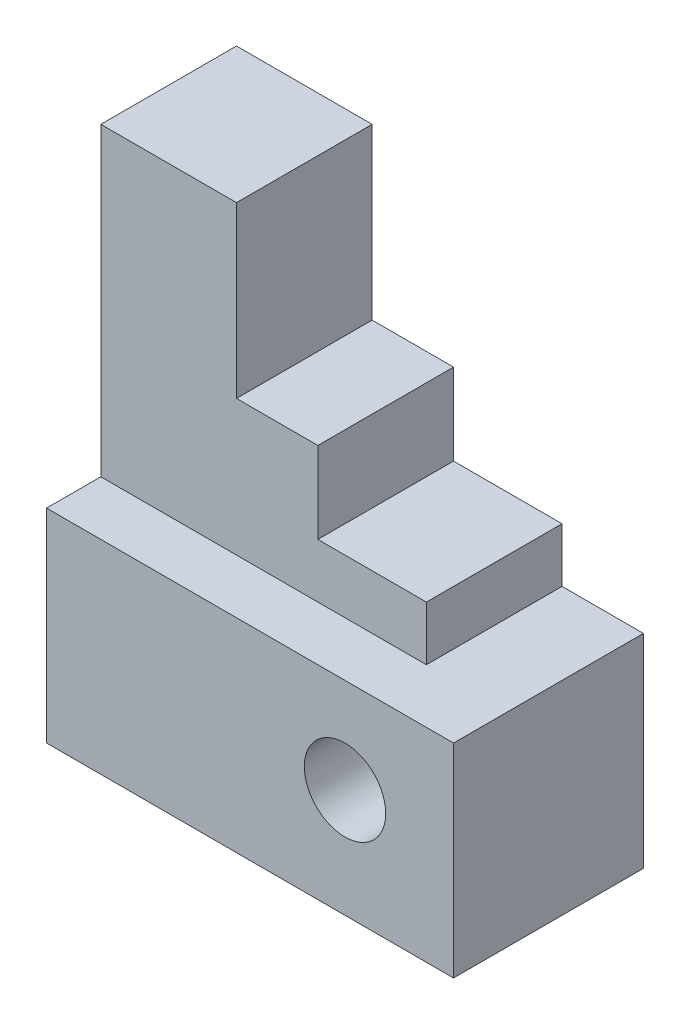
ISO-10303-21;
HEADER;
FILE_DESCRIPTION(('STEP AP214'),'2;1');
FILE_NAME('part.step','',(''),(''),'','','');
FILE_SCHEMA(('AUTOMOTIVE_DESIGN { 1 0 10303 214 1 1 1 1 }'));
ENDSEC;
DATA;
#1=APPLICATION_CONTEXT('core data for automotive mechanical design processes');
#2=APPLICATION_PROTOCOL_DEFINITION('international standard','automotive_design',2000,#1);
#3=PRODUCT_CONTEXT('',#1,'mechanical');
#4=PRODUCT('Part','Part','',(#3));
#5=PRODUCT_RELATED_PRODUCT_CATEGORY('part','',(#4));
#6=PRODUCT_DEFINITION_FORMATION('','',#4);
#7=PRODUCT_DEFINITION_CONTEXT('part definition',#1,'design');
#8=PRODUCT_DEFINITION('design','',#6,#7);
#9=PRODUCT_DEFINITION_SHAPE('','',#8);
#10=(LENGTH_UNIT() NAMED_UNIT(*) SI_UNIT(.MILLI.,.METRE.));
#11=(NAMED_UNIT(*) PLANE_ANGLE_UNIT() SI_UNIT($,.RADIAN.));
#12=(NAMED_UNIT(*) SI_UNIT($,.STERADIAN.) SOLID_ANGLE_UNIT());
#13=UNCERTAINTY_MEASURE_WITH_UNIT(LENGTH_MEASURE(1.E-05),#10,'distance_accuracy_value','');
#14=(GEOMETRIC_REPRESENTATION_CONTEXT(3) GLOBAL_UNCERTAINTY_ASSIGNED_CONTEXT((#13)) GLOBAL_UNIT_ASSIGNED_CONTEXT((#10,
#11,#12)) REPRESENTATION_CONTEXT('',''));
#15=CARTESIAN_POINT('',(0.,0.,0.));
#16=DIRECTION('',(0.,0.,1.));
#17=DIRECTION('',(1.,0.,0.));
#18=AXIS2_PLACEMENT_3D('',#15,#16,#17);
#19=CARTESIAN_POINT('',(0.,0.,28.));
#20=DIRECTION('',(0.,1.,0.));
#21=DIRECTION('',(0.,0.,1.));
#22=AXIS2_PLACEMENT_3D('',#19,#20,#21);
#23=PLANE('',#22);
#24=DIRECTION('',(1.,0.,0.));
#25=VECTOR('',#24,1.);
#26=CARTESIAN_POINT('',(0.,0.,0.));
#27=LINE('',#26,#25);
#28=CARTESIAN_POINT('',(0.,0.,0.));
#29=VERTEX_POINT('',#28);
#30=CARTESIAN_POINT('',(60.,0.,0.));
#31=VERTEX_POINT('',#30);
#32=EDGE_CURVE('E239',#29,#31,#27,.T.);
#33=ORIENTED_EDGE('',*,*,#32,.T.);
#34=DIRECTION('',(0.,0.,-1.));
#35=VECTOR('',#34,1.);
#36=CARTESIAN_POINT('',(60.,0.,28.));
#37=LINE('',#36,#35);
#38=CARTESIAN_POINT('',(60.,0.,28.));
#39=VERTEX_POINT('',#38);
#40=EDGE_CURVE('E11',#39,#31,#37,.T.);
#41=ORIENTED_EDGE('',*,*,#40,.F.);
#42=DIRECTION('',(1.,0.,0.));
#43=VECTOR('',#42,1.);
#44=CARTESIAN_POINT('',(0.,0.,28.));
#45=LINE('',#44,#43);
#46=CARTESIAN_POINT('',(0.,0.,28.));
#47=VERTEX_POINT('',#46);
#48=EDGE_CURVE('E219',#47,#39,#45,.T.);
#49=ORIENTED_EDGE('',*,*,#48,.F.);
#50=DIRECTION('',(0.,0.,-1.));
#51=VECTOR('',#50,1.);
#52=CARTESIAN_POINT('',(0.,0.,28.));
#53=LINE('',#52,#51);
#54=EDGE_CURVE('E235',#47,#29,#53,.T.);
#55=ORIENTED_EDGE('',*,*,#54,.T.);
#56=EDGE_LOOP('',(#33,#41,#49,#55));
#57=FACE_BOUND('',#56,.T.);
#58=ADVANCED_FACE('F45',(#57),#23,.F.);
#59=CARTESIAN_POINT('',(60.,0.,28.));
#60=DIRECTION('',(-1.,0.,0.));
#61=DIRECTION('',(0.,0.,1.));
#62=AXIS2_PLACEMENT_3D('',#59,#60,#61);
#63=PLANE('',#62);
#64=DIRECTION('',(0.,1.,0.));
#65=VECTOR('',#64,1.);
#66=CARTESIAN_POINT('',(60.,0.,0.));
#67=LINE('',#66,#65);
#68=CARTESIAN_POINT('',(60.,30.,0.));
#69=VERTEX_POINT('',#68);
#70=EDGE_CURVE('E243',#31,#69,#67,.T.);
#71=ORIENTED_EDGE('',*,*,#70,.T.);
#72=DIRECTION('',(0.,0.,-1.));
#73=VECTOR('',#72,1.);
#74=CARTESIAN_POINT('',(60.,30.,28.));
#75=LINE('',#74,#73);
#76=CARTESIAN_POINT('',(60.,30.,28.));
#77=VERTEX_POINT('',#76);
#78=EDGE_CURVE('E54',#77,#69,#75,.T.);
#79=ORIENTED_EDGE('',*,*,#78,.F.);
#80=DIRECTION('',(0.,1.,0.));
#81=VECTOR('',#80,1.);
#82=CARTESIAN_POINT('',(60.,0.,28.));
#83=LINE('',#82,#81);
#84=EDGE_CURVE('E224',#39,#77,#83,.T.);
#85=ORIENTED_EDGE('',*,*,#84,.F.);
#86=ORIENTED_EDGE('',*,*,#40,.T.);
#87=EDGE_LOOP('',(#71,#79,#85,#86));
#88=FACE_BOUND('',#87,.T.);
#89=ADVANCED_FACE('F260',(#88),#63,.F.);
#90=CARTESIAN_POINT('',(0.,30.,28.));
#91=DIRECTION('',(0.,1.,0.));
#92=DIRECTION('',(0.,0.,1.));
#93=AXIS2_PLACEMENT_3D('',#90,#91,#92);
#94=PLANE('',#93);
#95=DIRECTION('',(0.,0.,-1.));
#96=VECTOR('',#95,1.);
#97=CARTESIAN_POINT('',(48.,30.,20.));
#98=LINE('',#97,#96);
#99=CARTESIAN_POINT('',(48.,30.,20.));
#100=VERTEX_POINT('',#99);
#101=CARTESIAN_POINT('',(48.,30.,0.));
#102=VERTEX_POINT('',#101);
#103=EDGE_CURVE('E206',#100,#102,#98,.T.);
#104=ORIENTED_EDGE('',*,*,#103,.F.);
#105=DIRECTION('',(1.,0.,0.));
#106=VECTOR('',#105,1.);
#107=CARTESIAN_POINT('',(0.,30.,20.));
#108=LINE('',#107,#106);
#109=CARTESIAN_POINT('',(0.,30.,20.));
#110=VERTEX_POINT('',#109);
#111=EDGE_CURVE('E61',#110,#100,#108,.T.);
#112=ORIENTED_EDGE('',*,*,#111,.F.);
#113=DIRECTION('',(0.,0.,-1.));
#114=VECTOR('',#113,1.);
#115=CARTESIAN_POINT('',(0.,30.,28.));
#116=LINE('',#115,#114);
#117=CARTESIAN_POINT('',(0.,30.,28.));
#118=VERTEX_POINT('',#117);
#119=EDGE_CURVE('E253',#118,#110,#116,.T.);
#120=ORIENTED_EDGE('',*,*,#119,.F.);
#121=DIRECTION('',(1.,0.,0.));
#122=VECTOR('',#121,1.);
#123=CARTESIAN_POINT('',(0.,30.,28.));
#124=LINE('',#123,#122);
#125=EDGE_CURVE('E227',#118,#77,#124,.T.);
#126=ORIENTED_EDGE('',*,*,#125,.T.);
#127=ORIENTED_EDGE('',*,*,#78,.T.);
#128=DIRECTION('',(1.,0.,0.));
#129=VECTOR('',#128,1.);
#130=CARTESIAN_POINT('',(0.,30.,0.));
#131=LINE('',#130,#129);
#132=EDGE_CURVE('E67',#102,#69,#131,.T.);
#133=ORIENTED_EDGE('',*,*,#132,.F.);
#134=EDGE_LOOP('',(#104,#112,#120,#126,#127,#133));
#135=FACE_BOUND('',#134,.T.);
#136=ADVANCED_FACE('F257',(#135),#94,.T.);
#137=CARTESIAN_POINT('',(44.,16.,28.));
#138=DIRECTION('',(0.,0.,-1.));
#139=DIRECTION('',(-1.,0.,0.));
#140=AXIS2_PLACEMENT_3D('',#137,#138,#139);
#141=CYLINDRICAL_SURFACE('',#140,6.);
#142=CARTESIAN_POINT('',(44.,16.,28.));
#143=DIRECTION('',(0.,0.,1.));
#144=DIRECTION('',(1.,0.,0.));
#145=AXIS2_PLACEMENT_3D('',#142,#143,#144);
#146=CIRCLE('',#145,6.);
#147=CARTESIAN_POINT('',(50.,16.,28.));
#148=VERTEX_POINT('',#147);
#149=EDGE_CURVE('E215',#148,#148,#146,.T.);
#150=ORIENTED_EDGE('',*,*,#149,.T.);
#151=EDGE_LOOP('',(#150));
#152=FACE_BOUND('',#151,.T.);
#153=CARTESIAN_POINT('',(44.,16.,0.));
#154=DIRECTION('',(0.,0.,1.));
#155=DIRECTION('',(1.,0.,0.));
#156=AXIS2_PLACEMENT_3D('',#153,#154,#155);
#157=CIRCLE('',#156,6.);
#158=CARTESIAN_POINT('',(50.,16.,0.));
#159=VERTEX_POINT('',#158);
#160=EDGE_CURVE('E139',#159,#159,#157,.T.);
#161=ORIENTED_EDGE('',*,*,#160,.F.);
#162=EDGE_LOOP('',(#161));
#163=FACE_BOUND('',#162,.T.);
#164=ADVANCED_FACE('F47',(#152,#163),#141,.F.);
#165=CARTESIAN_POINT('',(0.,0.,28.));
#166=DIRECTION('',(-1.,0.,0.));
#167=DIRECTION('',(0.,0.,1.));
#168=AXIS2_PLACEMENT_3D('',#165,#166,#167);
#169=PLANE('',#168);
#170=DIRECTION('',(0.,1.,0.));
#171=VECTOR('',#170,1.);
#172=CARTESIAN_POINT('',(0.,0.,0.));
#173=LINE('',#172,#171);
#174=CARTESIAN_POINT('',(0.,75.,0.));
#175=VERTEX_POINT('',#174);
#176=EDGE_CURVE('E220',#29,#175,#173,.T.);
#177=ORIENTED_EDGE('',*,*,#176,.F.);
#178=ORIENTED_EDGE('',*,*,#54,.F.);
#179=DIRECTION('',(0.,1.,0.));
#180=VECTOR('',#179,1.);
#181=CARTESIAN_POINT('',(0.,0.,28.));
#182=LINE('',#181,#180);
#183=EDGE_CURVE('E231',#47,#118,#182,.T.);
#184=ORIENTED_EDGE('',*,*,#183,.T.);
#185=ORIENTED_EDGE('',*,*,#119,.T.);
#186=DIRECTION('',(0.,1.,0.));
#187=VECTOR('',#186,1.);
#188=CARTESIAN_POINT('',(0.,0.,20.));
#189=LINE('',#188,#187);
#190=CARTESIAN_POINT('',(0.,75.,20.));
#191=VERTEX_POINT('',#190);
#192=EDGE_CURVE('E166',#110,#191,#189,.T.);
#193=ORIENTED_EDGE('',*,*,#192,.T.);
#194=DIRECTION('',(0.,0.,-1.));
#195=VECTOR('',#194,1.);
#196=CARTESIAN_POINT('',(0.,75.,20.));
#197=LINE('',#196,#195);
#198=EDGE_CURVE('E209',#191,#175,#197,.T.);
#199=ORIENTED_EDGE('',*,*,#198,.T.);
#200=EDGE_LOOP('',(#177,#178,#184,#185,#193,#199));
#201=FACE_BOUND('',#200,.T.);
#202=ADVANCED_FACE('F275',(#201),#169,.T.);
#203=CARTESIAN_POINT('',(0.,0.,28.));
#204=DIRECTION('',(0.,0.,1.));
#205=DIRECTION('',(1.,0.,0.));
#206=AXIS2_PLACEMENT_3D('',#203,#204,#205);
#207=PLANE('',#206);
#208=ORIENTED_EDGE('',*,*,#149,.F.);
#209=EDGE_LOOP('',(#208));
#210=FACE_BOUND('',#209,.T.);
#211=ORIENTED_EDGE('',*,*,#48,.T.);
#212=ORIENTED_EDGE('',*,*,#84,.T.);
#213=ORIENTED_EDGE('',*,*,#125,.F.);
#214=ORIENTED_EDGE('',*,*,#183,.F.);
#215=EDGE_LOOP('',(#211,#212,#213,#214));
#216=FACE_BOUND('',#215,.T.);
#217=ADVANCED_FACE('F279',(#210,#216),#207,.T.);
#218=CARTESIAN_POINT('',(0.,0.,0.));
#219=DIRECTION('',(0.,0.,1.));
#220=DIRECTION('',(1.,0.,0.));
#221=AXIS2_PLACEMENT_3D('',#218,#219,#220);
#222=PLANE('',#221);
#223=ORIENTED_EDGE('',*,*,#160,.T.);
#224=EDGE_LOOP('',(#223));
#225=FACE_BOUND('',#224,.T.);
#226=ORIENTED_EDGE('',*,*,#32,.F.);
#227=ORIENTED_EDGE('',*,*,#176,.T.);
#228=DIRECTION('',(1.,0.,0.));
#229=VECTOR('',#228,1.);
#230=CARTESIAN_POINT('',(0.,75.,0.));
#231=LINE('',#230,#229);
#232=CARTESIAN_POINT('',(20.,75.,0.));
#233=VERTEX_POINT('',#232);
#234=EDGE_CURVE('E187',#175,#233,#231,.T.);
#235=ORIENTED_EDGE('',*,*,#234,.T.);
#236=DIRECTION('',(0.,1.,0.));
#237=VECTOR('',#236,1.);
#238=CARTESIAN_POINT('',(20.,0.,0.));
#239=LINE('',#238,#237);
#240=CARTESIAN_POINT('',(20.,50.,0.));
#241=VERTEX_POINT('',#240);
#242=EDGE_CURVE('E184',#241,#233,#239,.T.);
#243=ORIENTED_EDGE('',*,*,#242,.F.);
#244=DIRECTION('',(1.,0.,0.));
#245=VECTOR('',#244,1.);
#246=CARTESIAN_POINT('',(0.,50.,0.));
#247=LINE('',#246,#245);
#248=CARTESIAN_POINT('',(32.,50.,0.));
#249=VERTEX_POINT('',#248);
#250=EDGE_CURVE('E134',#241,#249,#247,.T.);
#251=ORIENTED_EDGE('',*,*,#250,.T.);
#252=DIRECTION('',(0.,1.,0.));
#253=VECTOR('',#252,1.);
#254=CARTESIAN_POINT('',(32.,0.,0.));
#255=LINE('',#254,#253);
#256=CARTESIAN_POINT('',(32.,38.,0.));
#257=VERTEX_POINT('',#256);
#258=EDGE_CURVE('E157',#257,#249,#255,.T.);
#259=ORIENTED_EDGE('',*,*,#258,.F.);
#260=DIRECTION('',(1.,0.,0.));
#261=VECTOR('',#260,1.);
#262=CARTESIAN_POINT('',(0.,38.,0.));
#263=LINE('',#262,#261);
#264=CARTESIAN_POINT('',(48.,38.,0.));
#265=VERTEX_POINT('',#264);
#266=EDGE_CURVE('E161',#257,#265,#263,.T.);
#267=ORIENTED_EDGE('',*,*,#266,.T.);
#268=DIRECTION('',(0.,1.,0.));
#269=VECTOR('',#268,1.);
#270=CARTESIAN_POINT('',(48.,0.,0.));
#271=LINE('',#270,#269);
#272=EDGE_CURVE('E191',#102,#265,#271,.T.);
#273=ORIENTED_EDGE('',*,*,#272,.F.);
#274=ORIENTED_EDGE('',*,*,#132,.T.);
#275=ORIENTED_EDGE('',*,*,#70,.F.);
#276=EDGE_LOOP('',(#226,#227,#235,#243,#251,#259,#267,#273,#274,#275));
#277=FACE_BOUND('',#276,.T.);
#278=ADVANCED_FACE('F264',(#225,#277),#222,.F.);
#279=CARTESIAN_POINT('',(0.,50.,20.));
#280=DIRECTION('',(0.,1.,0.));
#281=DIRECTION('',(0.,0.,1.));
#282=AXIS2_PLACEMENT_3D('',#279,#280,#281);
#283=PLANE('',#282);
#284=ORIENTED_EDGE('',*,*,#250,.F.);
#285=DIRECTION('',(0.,0.,-1.));
#286=VECTOR('',#285,1.);
#287=CARTESIAN_POINT('',(20.,50.,20.));
#288=LINE('',#287,#286);
#289=CARTESIAN_POINT('',(20.,50.,20.));
#290=VERTEX_POINT('',#289);
#291=EDGE_CURVE('E128',#290,#241,#288,.T.);
#292=ORIENTED_EDGE('',*,*,#291,.F.);
#293=DIRECTION('',(1.,0.,0.));
#294=VECTOR('',#293,1.);
#295=CARTESIAN_POINT('',(0.,50.,20.));
#296=LINE('',#295,#294);
#297=CARTESIAN_POINT('',(32.,50.,20.));
#298=VERTEX_POINT('',#297);
#299=EDGE_CURVE('E132',#290,#298,#296,.T.);
#300=ORIENTED_EDGE('',*,*,#299,.T.);
#301=DIRECTION('',(0.,0.,-1.));
#302=VECTOR('',#301,1.);
#303=CARTESIAN_POINT('',(32.,50.,20.));
#304=LINE('',#303,#302);
#305=EDGE_CURVE('E181',#298,#249,#304,.T.);
#306=ORIENTED_EDGE('',*,*,#305,.T.);
#307=EDGE_LOOP('',(#284,#292,#300,#306));
#308=FACE_BOUND('',#307,.T.);
#309=ADVANCED_FACE('F130',(#308),#283,.T.);
#310=CARTESIAN_POINT('',(20.,0.,20.));
#311=DIRECTION('',(-1.,0.,0.));
#312=DIRECTION('',(0.,0.,1.));
#313=AXIS2_PLACEMENT_3D('',#310,#311,#312);
#314=PLANE('',#313);
#315=ORIENTED_EDGE('',*,*,#242,.T.);
#316=DIRECTION('',(0.,0.,-1.));
#317=VECTOR('',#316,1.);
#318=CARTESIAN_POINT('',(20.,75.,20.));
#319=LINE('',#318,#317);
#320=CARTESIAN_POINT('',(20.,75.,20.));
#321=VERTEX_POINT('',#320);
#322=EDGE_CURVE('E140',#321,#233,#319,.T.);
#323=ORIENTED_EDGE('',*,*,#322,.F.);
#324=DIRECTION('',(0.,1.,0.));
#325=VECTOR('',#324,1.);
#326=CARTESIAN_POINT('',(20.,0.,20.));
#327=LINE('',#326,#325);
#328=EDGE_CURVE('E143',#290,#321,#327,.T.);
#329=ORIENTED_EDGE('',*,*,#328,.F.);
#330=ORIENTED_EDGE('',*,*,#291,.T.);
#331=EDGE_LOOP('',(#315,#323,#329,#330));
#332=FACE_BOUND('',#331,.T.);
#333=ADVANCED_FACE('F144',(#332),#314,.F.);
#334=CARTESIAN_POINT('',(0.,75.,20.));
#335=DIRECTION('',(0.,1.,0.));
#336=DIRECTION('',(0.,0.,1.));
#337=AXIS2_PLACEMENT_3D('',#334,#335,#336);
#338=PLANE('',#337);
#339=ORIENTED_EDGE('',*,*,#234,.F.);
#340=ORIENTED_EDGE('',*,*,#198,.F.);
#341=DIRECTION('',(1.,0.,0.));
#342=VECTOR('',#341,1.);
#343=CARTESIAN_POINT('',(0.,75.,20.));
#344=LINE('',#343,#342);
#345=EDGE_CURVE('E149',#191,#321,#344,.T.);
#346=ORIENTED_EDGE('',*,*,#345,.T.);
#347=ORIENTED_EDGE('',*,*,#322,.T.);
#348=EDGE_LOOP('',(#339,#340,#346,#347));
#349=FACE_BOUND('',#348,.T.);
#350=ADVANCED_FACE('F283',(#349),#338,.T.);
#351=CARTESIAN_POINT('',(48.,0.,20.));
#352=DIRECTION('',(-1.,0.,0.));
#353=DIRECTION('',(0.,0.,1.));
#354=AXIS2_PLACEMENT_3D('',#351,#352,#353);
#355=PLANE('',#354);
#356=ORIENTED_EDGE('',*,*,#272,.T.);
#357=DIRECTION('',(0.,0.,-1.));
#358=VECTOR('',#357,1.);
#359=CARTESIAN_POINT('',(48.,38.,20.));
#360=LINE('',#359,#358);
#361=CARTESIAN_POINT('',(48.,38.,20.));
#362=VERTEX_POINT('',#361);
#363=EDGE_CURVE('E203',#362,#265,#360,.T.);
#364=ORIENTED_EDGE('',*,*,#363,.F.);
#365=DIRECTION('',(0.,1.,0.));
#366=VECTOR('',#365,1.);
#367=CARTESIAN_POINT('',(48.,0.,20.));
#368=LINE('',#367,#366);
#369=EDGE_CURVE('E172',#100,#362,#368,.T.);
#370=ORIENTED_EDGE('',*,*,#369,.F.);
#371=ORIENTED_EDGE('',*,*,#103,.T.);
#372=EDGE_LOOP('',(#356,#364,#370,#371));
#373=FACE_BOUND('',#372,.T.);
#374=ADVANCED_FACE('F271',(#373),#355,.F.);
#375=CARTESIAN_POINT('',(0.,38.,20.));
#376=DIRECTION('',(0.,1.,0.));
#377=DIRECTION('',(0.,0.,1.));
#378=AXIS2_PLACEMENT_3D('',#375,#376,#377);
#379=PLANE('',#378);
#380=ORIENTED_EDGE('',*,*,#266,.F.);
#381=DIRECTION('',(0.,0.,-1.));
#382=VECTOR('',#381,1.);
#383=CARTESIAN_POINT('',(32.,38.,20.));
#384=LINE('',#383,#382);
#385=CARTESIAN_POINT('',(32.,38.,20.));
#386=VERTEX_POINT('',#385);
#387=EDGE_CURVE('E200',#386,#257,#384,.T.);
#388=ORIENTED_EDGE('',*,*,#387,.F.);
#389=DIRECTION('',(1.,0.,0.));
#390=VECTOR('',#389,1.);
#391=CARTESIAN_POINT('',(0.,38.,20.));
#392=LINE('',#391,#390);
#393=EDGE_CURVE('E175',#386,#362,#392,.T.);
#394=ORIENTED_EDGE('',*,*,#393,.T.);
#395=ORIENTED_EDGE('',*,*,#363,.T.);
#396=EDGE_LOOP('',(#380,#388,#394,#395));
#397=FACE_BOUND('',#396,.T.);
#398=ADVANCED_FACE('F290',(#397),#379,.T.);
#399=CARTESIAN_POINT('',(32.,0.,20.));
#400=DIRECTION('',(-1.,0.,0.));
#401=DIRECTION('',(0.,0.,1.));
#402=AXIS2_PLACEMENT_3D('',#399,#400,#401);
#403=PLANE('',#402);
#404=ORIENTED_EDGE('',*,*,#258,.T.);
#405=ORIENTED_EDGE('',*,*,#305,.F.);
#406=DIRECTION('',(0.,1.,0.));
#407=VECTOR('',#406,1.);
#408=CARTESIAN_POINT('',(32.,0.,20.));
#409=LINE('',#408,#407);
#410=EDGE_CURVE('E154',#386,#298,#409,.T.);
#411=ORIENTED_EDGE('',*,*,#410,.F.);
#412=ORIENTED_EDGE('',*,*,#387,.T.);
#413=EDGE_LOOP('',(#404,#405,#411,#412));
#414=FACE_BOUND('',#413,.T.);
#415=ADVANCED_FACE('F340',(#414),#403,.F.);
#416=CARTESIAN_POINT('',(0.,0.,20.));
#417=DIRECTION('',(0.,0.,1.));
#418=DIRECTION('',(1.,0.,0.));
#419=AXIS2_PLACEMENT_3D('',#416,#417,#418);
#420=PLANE('',#419);
#421=ORIENTED_EDGE('',*,*,#299,.F.);
#422=ORIENTED_EDGE('',*,*,#328,.T.);
#423=ORIENTED_EDGE('',*,*,#345,.F.);
#424=ORIENTED_EDGE('',*,*,#192,.F.);
#425=ORIENTED_EDGE('',*,*,#111,.T.);
#426=ORIENTED_EDGE('',*,*,#369,.T.);
#427=ORIENTED_EDGE('',*,*,#393,.F.);
#428=ORIENTED_EDGE('',*,*,#410,.T.);
#429=EDGE_LOOP('',(#421,#422,#423,#424,#425,#426,#427,#428));
#430=FACE_BOUND('',#429,.T.);
#431=ADVANCED_FACE('F151',(#430),#420,.T.);
#432=CLOSED_SHELL('',(#58,#89,#136,#164,#202,#217,#278,#309,#333,#350,#374,#398,#415,#431));
#433=MANIFOLD_SOLID_BREP('B2',#432);
#434=ADVANCED_BREP_SHAPE_REPRESENTATION('',(#18,#433),#14);
#435=SHAPE_DEFINITION_REPRESENTATION(#9,#434);
ENDSEC;
END-ISO-10303-21;
